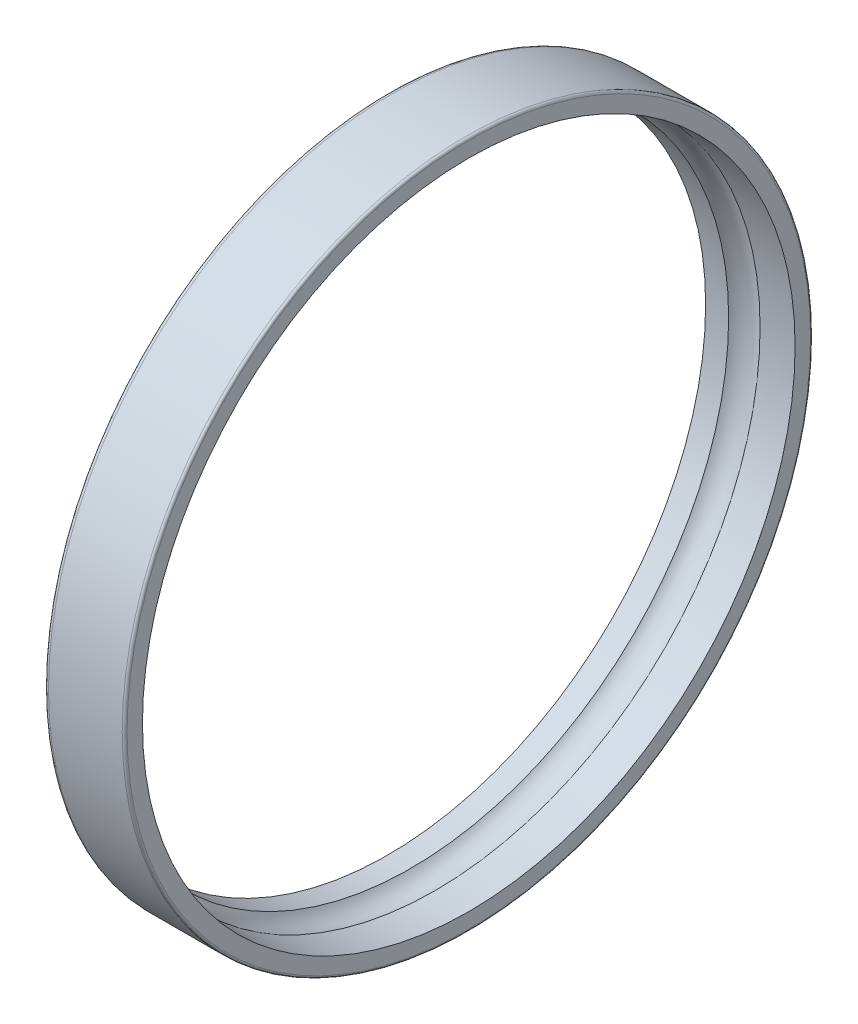
ISO-10303-21;
HEADER;
FILE_DESCRIPTION(('STEP AP214'),'2;1');
FILE_NAME('part.step','',(''),(''),'','','');
FILE_SCHEMA(('AUTOMOTIVE_DESIGN { 1 0 10303 214 1 1 1 1 }'));
ENDSEC;
DATA;
#1=APPLICATION_CONTEXT('core data for automotive mechanical design processes');
#2=APPLICATION_PROTOCOL_DEFINITION('international standard','automotive_design',2000,#1);
#3=PRODUCT_CONTEXT('',#1,'mechanical');
#4=PRODUCT('Part','Part','',(#3));
#5=PRODUCT_RELATED_PRODUCT_CATEGORY('part','',(#4));
#6=PRODUCT_DEFINITION_FORMATION('','',#4);
#7=PRODUCT_DEFINITION_CONTEXT('part definition',#1,'design');
#8=PRODUCT_DEFINITION('design','',#6,#7);
#9=PRODUCT_DEFINITION_SHAPE('','',#8);
#10=(LENGTH_UNIT() NAMED_UNIT(*) SI_UNIT(.MILLI.,.METRE.));
#11=(NAMED_UNIT(*) PLANE_ANGLE_UNIT() SI_UNIT($,.RADIAN.));
#12=(NAMED_UNIT(*) SI_UNIT($,.STERADIAN.) SOLID_ANGLE_UNIT());
#13=UNCERTAINTY_MEASURE_WITH_UNIT(LENGTH_MEASURE(1.E-05),#10,'distance_accuracy_value','');
#14=(GEOMETRIC_REPRESENTATION_CONTEXT(3) GLOBAL_UNCERTAINTY_ASSIGNED_CONTEXT((#13)) GLOBAL_UNIT_ASSIGNED_CONTEXT((#10,
#11,#12)) REPRESENTATION_CONTEXT('',''));
#15=CARTESIAN_POINT('',(0.,0.,0.));
#16=DIRECTION('',(0.,0.,1.));
#17=DIRECTION('',(1.,0.,0.));
#18=AXIS2_PLACEMENT_3D('',#15,#16,#17);
#19=CARTESIAN_POINT('',(9.69999999994332,0.,0.));
#20=DIRECTION('',(1.,0.,0.));
#21=DIRECTION('',(0.,0.,-1.00000000000001));
#22=AXIS2_PLACEMENT_3D('',#19,#20,#21);
#23=TOROIDAL_SURFACE('',#22,42.2,0.300000000056682);
#24=CARTESIAN_POINT('',(9.69999999994332,0.,0.));
#25=DIRECTION('',(1.,0.,0.));
#26=DIRECTION('',(0.,0.,-1.00000000000001));
#27=AXIS2_PLACEMENT_3D('',#24,#25,#26);
#28=CIRCLE('',#27,42.5000000000567);
#29=CARTESIAN_POINT('',(9.69999999994332,0.,-42.5000000000569));
#30=VERTEX_POINT('',#29);
#31=EDGE_CURVE('E10',#30,#30,#28,.T.);
#32=ORIENTED_EDGE('',*,*,#31,.T.);
#33=EDGE_LOOP('',(#32));
#34=FACE_BOUND('',#33,.T.);
#35=CARTESIAN_POINT('',(10.,0.,0.));
#36=DIRECTION('',(1.,0.,0.));
#37=DIRECTION('',(0.,0.,-1.00000000000001));
#38=AXIS2_PLACEMENT_3D('',#35,#36,#37);
#39=CIRCLE('',#38,42.2);
#40=CARTESIAN_POINT('',(10.,0.,-42.2000000000002));
#41=VERTEX_POINT('',#40);
#42=EDGE_CURVE('E56',#41,#41,#39,.T.);
#43=ORIENTED_EDGE('',*,*,#42,.F.);
#44=EDGE_LOOP('',(#43));
#45=FACE_BOUND('',#44,.T.);
#46=ADVANCED_FACE('F28',(#34,#45),#23,.T.);
#47=CARTESIAN_POINT('',(-0.00127048827445325,0.,0.));
#48=DIRECTION('',(1.,0.,0.));
#49=DIRECTION('',(0.,0.,-1.00000000000001));
#50=AXIS2_PLACEMENT_3D('',#47,#48,#49);
#51=CYLINDRICAL_SURFACE('',#50,42.5000000000567);
#52=CARTESIAN_POINT('',(0.599999999943084,0.,0.));
#53=DIRECTION('',(1.,0.,0.));
#54=DIRECTION('',(0.,0.,-1.00000000000001));
#55=AXIS2_PLACEMENT_3D('',#52,#53,#54);
#56=CIRCLE('',#55,42.5000000000567);
#57=CARTESIAN_POINT('',(0.599999999943084,0.,-42.5000000000569));
#58=VERTEX_POINT('',#57);
#59=EDGE_CURVE('E34',#58,#58,#56,.T.);
#60=ORIENTED_EDGE('',*,*,#59,.T.);
#61=EDGE_LOOP('',(#60));
#62=FACE_BOUND('',#61,.T.);
#63=ORIENTED_EDGE('',*,*,#31,.F.);
#64=EDGE_LOOP('',(#63));
#65=FACE_BOUND('',#64,.T.);
#66=ADVANCED_FACE('F64',(#62,#65),#51,.T.);
#67=CARTESIAN_POINT('',(0.599999999943084,0.,0.));
#68=DIRECTION('',(1.,0.,0.));
#69=DIRECTION('',(0.,0.,-1.00000000000001));
#70=AXIS2_PLACEMENT_3D('',#67,#68,#69);
#71=TOROIDAL_SURFACE('',#70,41.9000000000568,0.599999999999913);
#72=CARTESIAN_POINT('',(-5.68295410730002E-11,0.,0.));
#73=DIRECTION('',(1.,0.,0.));
#74=DIRECTION('',(0.,0.,-1.00000000000001));
#75=AXIS2_PLACEMENT_3D('',#72,#73,#74);
#76=CIRCLE('',#75,41.9000000000568);
#77=CARTESIAN_POINT('',(-5.68295410730002E-11,0.,-41.900000000057));
#78=VERTEX_POINT('',#77);
#79=EDGE_CURVE('E38',#78,#78,#76,.T.);
#80=ORIENTED_EDGE('',*,*,#79,.T.);
#81=EDGE_LOOP('',(#80));
#82=FACE_BOUND('',#81,.T.);
#83=ORIENTED_EDGE('',*,*,#59,.F.);
#84=EDGE_LOOP('',(#83));
#85=FACE_BOUND('',#84,.T.);
#86=ADVANCED_FACE('F68',(#82,#85),#71,.T.);
#87=CARTESIAN_POINT('',(-5.68295410730002E-11,41.9000000000569,0.));
#88=DIRECTION('',(-1.,0.,0.));
#89=DIRECTION('',(0.,0.,1.00000000000001));
#90=AXIS2_PLACEMENT_3D('',#87,#88,#89);
#91=PLANE('',#90);
#92=CARTESIAN_POINT('',(-5.68295410730002E-11,0.,0.));
#93=DIRECTION('',(1.,0.,0.));
#94=DIRECTION('',(0.,0.,-1.00000000000001));
#95=AXIS2_PLACEMENT_3D('',#92,#93,#94);
#96=CIRCLE('',#95,39.25);
#97=CARTESIAN_POINT('',(-5.68295410730002E-11,0.,-39.2500000000002));
#98=VERTEX_POINT('',#97);
#99=EDGE_CURVE('E42',#98,#98,#96,.T.);
#100=ORIENTED_EDGE('',*,*,#99,.T.);
#101=EDGE_LOOP('',(#100));
#102=FACE_BOUND('',#101,.T.);
#103=ORIENTED_EDGE('',*,*,#79,.F.);
#104=EDGE_LOOP('',(#103));
#105=FACE_BOUND('',#104,.T.);
#106=ADVANCED_FACE('F72',(#102,#105),#91,.T.);
#107=CARTESIAN_POINT('',(-0.00127048827445325,0.,0.));
#108=DIRECTION('',(1.,0.,0.));
#109=DIRECTION('',(0.,0.,-1.00000000000001));
#110=AXIS2_PLACEMENT_3D('',#107,#108,#109);
#111=CYLINDRICAL_SURFACE('',#110,39.25);
#112=CARTESIAN_POINT('',(2.8425051564372,0.,0.));
#113=DIRECTION('',(1.,0.,0.));
#114=DIRECTION('',(0.,0.,-1.00000000000001));
#115=AXIS2_PLACEMENT_3D('',#112,#113,#114);
#116=CIRCLE('',#115,39.25);
#117=CARTESIAN_POINT('',(2.8425051564372,0.,-39.2500000000002));
#118=VERTEX_POINT('',#117);
#119=EDGE_CURVE('E47',#118,#118,#116,.T.);
#120=ORIENTED_EDGE('',*,*,#119,.T.);
#121=EDGE_LOOP('',(#120));
#122=FACE_BOUND('',#121,.T.);
#123=ORIENTED_EDGE('',*,*,#99,.F.);
#124=EDGE_LOOP('',(#123));
#125=FACE_BOUND('',#124,.T.);
#126=ADVANCED_FACE('F79',(#122,#125),#111,.F.);
#127=CARTESIAN_POINT('',(5.00000000000029,0.,0.));
#128=DIRECTION('',(1.,0.,0.));
#129=DIRECTION('',(0.,0.,-1.00000000000001));
#130=AXIS2_PLACEMENT_3D('',#127,#128,#129);
#131=TOROIDAL_SURFACE('',#130,37.4999999999986,2.77800000000116);
#132=CARTESIAN_POINT('',(5.82054902824079,0.,0.));
#133=DIRECTION('',(1.,0.,0.));
#134=DIRECTION('',(0.,0.,-1.00000000000001));
#135=AXIS2_PLACEMENT_3D('',#132,#133,#134);
#136=CIRCLE('',#135,40.154050356013);
#137=CARTESIAN_POINT('',(5.82054902824079,0.,-40.1540503560132));
#138=VERTEX_POINT('',#137);
#139=EDGE_CURVE('E50',#138,#138,#136,.T.);
#140=ORIENTED_EDGE('',*,*,#139,.T.);
#141=EDGE_LOOP('',(#140));
#142=FACE_BOUND('',#141,.T.);
#143=ORIENTED_EDGE('',*,*,#119,.F.);
#144=EDGE_LOOP('',(#143));
#145=FACE_BOUND('',#144,.T.);
#146=ADVANCED_FACE('F83',(#142,#145),#131,.F.);
#147=CARTESIAN_POINT('',(5.82054902824079,0.,0.));
#148=DIRECTION('',(1.,0.,0.));
#149=DIRECTION('',(0.,0.,-1.00000000000001));
#150=AXIS2_PLACEMENT_3D('',#147,#148,#149);
#151=CONICAL_SURFACE('',#150,40.154050356013,0.0349065850399278);
#152=CARTESIAN_POINT('',(10.,0.,0.));
#153=DIRECTION('',(1.,0.,0.));
#154=DIRECTION('',(0.,0.,-1.00000000000001));
#155=AXIS2_PLACEMENT_3D('',#152,#153,#154);
#156=CIRCLE('',#155,40.3);
#157=CARTESIAN_POINT('',(10.,0.,-40.3000000000002));
#158=VERTEX_POINT('',#157);
#159=EDGE_CURVE('E53',#158,#158,#156,.T.);
#160=ORIENTED_EDGE('',*,*,#159,.T.);
#161=EDGE_LOOP('',(#160));
#162=FACE_BOUND('',#161,.T.);
#163=ORIENTED_EDGE('',*,*,#139,.F.);
#164=EDGE_LOOP('',(#163));
#165=FACE_BOUND('',#164,.T.);
#166=ADVANCED_FACE('F87',(#162,#165),#151,.F.);
#167=CARTESIAN_POINT('',(10.,40.3000000000002,1.94289029309402E-13));
#168=DIRECTION('',(1.,0.,0.));
#169=DIRECTION('',(0.,0.,-1.00000000000001));
#170=AXIS2_PLACEMENT_3D('',#167,#168,#169);
#171=PLANE('',#170);
#172=ORIENTED_EDGE('',*,*,#42,.T.);
#173=EDGE_LOOP('',(#172));
#174=FACE_BOUND('',#173,.T.);
#175=ORIENTED_EDGE('',*,*,#159,.F.);
#176=EDGE_LOOP('',(#175));
#177=FACE_BOUND('',#176,.T.);
#178=ADVANCED_FACE('F60',(#174,#177),#171,.T.);
#179=CLOSED_SHELL('',(#46,#66,#86,#106,#126,#146,#166,#178));
#180=MANIFOLD_SOLID_BREP('B2',#179);
#181=ADVANCED_BREP_SHAPE_REPRESENTATION('',(#18,#180),#14);
#182=SHAPE_DEFINITION_REPRESENTATION(#9,#181);
ENDSEC;
END-ISO-10303-21;
